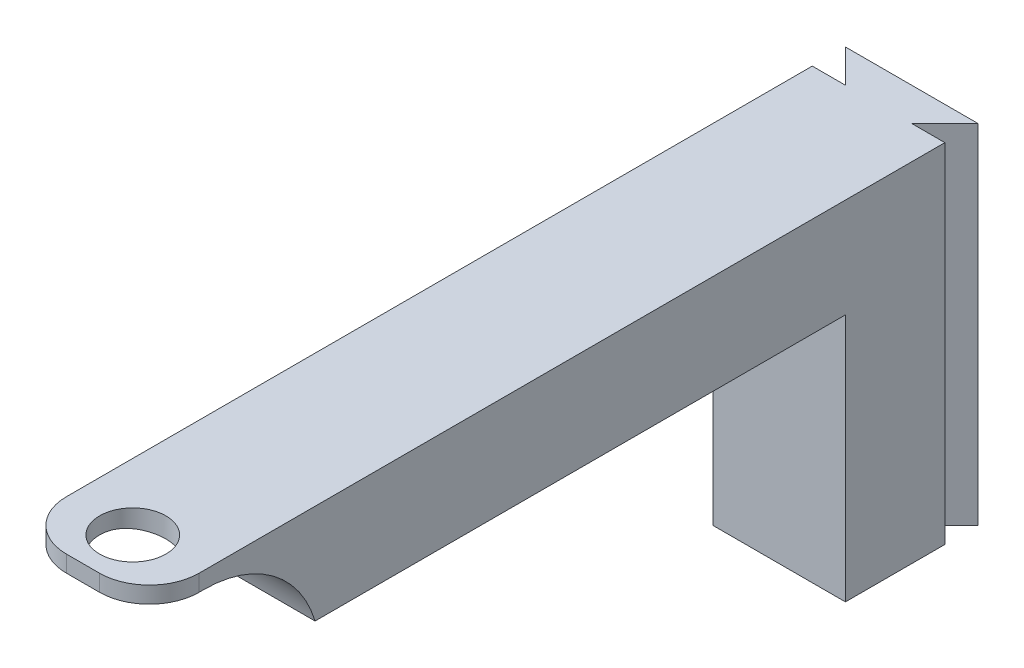
ISO-10303-21;
HEADER;
FILE_DESCRIPTION(('STEP AP214'),'2;1');
FILE_NAME('part.step','',(''),(''),'','','');
FILE_SCHEMA(('AUTOMOTIVE_DESIGN { 1 0 10303 214 1 1 1 1 }'));
ENDSEC;
DATA;
#1=APPLICATION_CONTEXT('core data for automotive mechanical design processes');
#2=APPLICATION_PROTOCOL_DEFINITION('international standard','automotive_design',2000,#1);
#3=PRODUCT_CONTEXT('',#1,'mechanical');
#4=PRODUCT('Part','Part','',(#3));
#5=PRODUCT_RELATED_PRODUCT_CATEGORY('part','',(#4));
#6=PRODUCT_DEFINITION_FORMATION('','',#4);
#7=PRODUCT_DEFINITION_CONTEXT('part definition',#1,'design');
#8=PRODUCT_DEFINITION('design','',#6,#7);
#9=PRODUCT_DEFINITION_SHAPE('','',#8);
#10=(LENGTH_UNIT() NAMED_UNIT(*) SI_UNIT(.MILLI.,.METRE.));
#11=(NAMED_UNIT(*) PLANE_ANGLE_UNIT() SI_UNIT($,.RADIAN.));
#12=(NAMED_UNIT(*) SI_UNIT($,.STERADIAN.) SOLID_ANGLE_UNIT());
#13=UNCERTAINTY_MEASURE_WITH_UNIT(LENGTH_MEASURE(1.E-05),#10,'distance_accuracy_value','');
#14=(GEOMETRIC_REPRESENTATION_CONTEXT(3) GLOBAL_UNCERTAINTY_ASSIGNED_CONTEXT((#13)) GLOBAL_UNIT_ASSIGNED_CONTEXT((#10,
#11,#12)) REPRESENTATION_CONTEXT('',''));
#15=CARTESIAN_POINT('',(0.,0.,0.));
#16=DIRECTION('',(0.,0.,1.));
#17=DIRECTION('',(1.,0.,0.));
#18=AXIS2_PLACEMENT_3D('',#15,#16,#17);
#19=CARTESIAN_POINT('',(4.,6.,25.));
#20=DIRECTION('',(-1.,0.,0.));
#21=DIRECTION('',(0.,0.,1.));
#22=AXIS2_PLACEMENT_3D('',#19,#20,#21);
#23=PLANE('',#22);
#24=DIRECTION('',(0.,-1.,0.));
#25=VECTOR('',#24,1.);
#26=CARTESIAN_POINT('',(4.,6.000012,-23.));
#27=LINE('',#26,#25);
#28=CARTESIAN_POINT('',(4.,6.,-23.));
#29=VERTEX_POINT('',#28);
#30=CARTESIAN_POINT('',(4.,-15.,-23.));
#31=VERTEX_POINT('',#30);
#32=EDGE_CURVE('E61',#29,#31,#27,.T.);
#33=ORIENTED_EDGE('',*,*,#32,.F.);
#34=DIRECTION('',(0.,0.,-1.));
#35=VECTOR('',#34,1.);
#36=CARTESIAN_POINT('',(4.,6.,25.));
#37=LINE('',#36,#35);
#38=CARTESIAN_POINT('',(4.,6.,22.));
#39=VERTEX_POINT('',#38);
#40=EDGE_CURVE('E206',#39,#29,#37,.T.);
#41=ORIENTED_EDGE('',*,*,#40,.F.);
#42=DIRECTION('',(0.,-1.,0.));
#43=VECTOR('',#42,1.);
#44=CARTESIAN_POINT('',(4.,6.,22.));
#45=LINE('',#44,#43);
#46=CARTESIAN_POINT('',(4.,5.,22.));
#47=VERTEX_POINT('',#46);
#48=EDGE_CURVE('E165',#39,#47,#45,.T.);
#49=ORIENTED_EDGE('',*,*,#48,.T.);
#50=DIRECTION('',(0.,0.,1.));
#51=VECTOR('',#50,1.);
#52=CARTESIAN_POINT('',(4.,5.,25.));
#53=LINE('',#52,#51);
#54=CARTESIAN_POINT('',(4.,5.,21.7082039324994));
#55=VERTEX_POINT('',#54);
#56=EDGE_CURVE('E195',#55,#47,#53,.T.);
#57=ORIENTED_EDGE('',*,*,#56,.F.);
#58=CARTESIAN_POINT('',(4.,-2.,21.7082039324994));
#59=DIRECTION('',(-1.,0.,0.));
#60=DIRECTION('',(0.,0.,1.));
#61=AXIS2_PLACEMENT_3D('',#58,#59,#60);
#62=CIRCLE('',#61,7.);
#63=CARTESIAN_POINT('',(4.,0.,15.));
#64=VERTEX_POINT('',#63);
#65=EDGE_CURVE('E46',#55,#64,#62,.T.);
#66=ORIENTED_EDGE('',*,*,#65,.T.);
#67=DIRECTION('',(0.,0.,-1.));
#68=VECTOR('',#67,1.);
#69=CARTESIAN_POINT('',(4.,0.,25.));
#70=LINE('',#69,#68);
#71=CARTESIAN_POINT('',(4.,0.,-17.));
#72=VERTEX_POINT('',#71);
#73=EDGE_CURVE('E203',#64,#72,#70,.T.);
#74=ORIENTED_EDGE('',*,*,#73,.T.);
#75=DIRECTION('',(0.,1.,0.));
#76=VECTOR('',#75,1.);
#77=CARTESIAN_POINT('',(4.,-15.,-17.));
#78=LINE('',#77,#76);
#79=CARTESIAN_POINT('',(4.,-15.,-17.));
#80=VERTEX_POINT('',#79);
#81=EDGE_CURVE('E174',#80,#72,#78,.T.);
#82=ORIENTED_EDGE('',*,*,#81,.F.);
#83=DIRECTION('',(0.,0.,1.));
#84=VECTOR('',#83,1.);
#85=CARTESIAN_POINT('',(4.,-15.,-25.));
#86=LINE('',#85,#84);
#87=EDGE_CURVE('E183',#31,#80,#86,.T.);
#88=ORIENTED_EDGE('',*,*,#87,.F.);
#89=EDGE_LOOP('',(#33,#41,#49,#57,#66,#74,#82,#88));
#90=FACE_BOUND('',#89,.T.);
#91=ADVANCED_FACE('F37',(#90),#23,.F.);
#92=CARTESIAN_POINT('',(-4.,6.,25.));
#93=DIRECTION('',(1.,0.,0.));
#94=DIRECTION('',(0.,0.,-1.));
#95=AXIS2_PLACEMENT_3D('',#92,#93,#94);
#96=PLANE('',#95);
#97=DIRECTION('',(0.,-1.,0.));
#98=VECTOR('',#97,1.);
#99=CARTESIAN_POINT('',(-4.,6.000012,-23.));
#100=LINE('',#99,#98);
#101=CARTESIAN_POINT('',(-4.,6.,-23.));
#102=VERTEX_POINT('',#101);
#103=CARTESIAN_POINT('',(-4.,-15.,-23.));
#104=VERTEX_POINT('',#103);
#105=EDGE_CURVE('E155',#102,#104,#100,.T.);
#106=ORIENTED_EDGE('',*,*,#105,.T.);
#107=DIRECTION('',(0.,0.,-1.));
#108=VECTOR('',#107,1.);
#109=CARTESIAN_POINT('',(-4.,-15.,-25.));
#110=LINE('',#109,#108);
#111=CARTESIAN_POINT('',(-4.,-15.,-17.));
#112=VERTEX_POINT('',#111);
#113=EDGE_CURVE('E171',#112,#104,#110,.T.);
#114=ORIENTED_EDGE('',*,*,#113,.F.);
#115=DIRECTION('',(0.,1.,0.));
#116=VECTOR('',#115,1.);
#117=CARTESIAN_POINT('',(-4.,-15.,-17.));
#118=LINE('',#117,#116);
#119=CARTESIAN_POINT('',(-4.,0.,-17.));
#120=VERTEX_POINT('',#119);
#121=EDGE_CURVE('E170',#112,#120,#118,.T.);
#122=ORIENTED_EDGE('',*,*,#121,.T.);
#123=DIRECTION('',(0.,0.,1.));
#124=VECTOR('',#123,1.);
#125=CARTESIAN_POINT('',(-4.,0.,25.));
#126=LINE('',#125,#124);
#127=CARTESIAN_POINT('',(-4.,0.,15.));
#128=VERTEX_POINT('',#127);
#129=EDGE_CURVE('E209',#120,#128,#126,.T.);
#130=ORIENTED_EDGE('',*,*,#129,.T.);
#131=CARTESIAN_POINT('',(-4.,-2.,21.7082039324994));
#132=DIRECTION('',(1.,0.,0.));
#133=DIRECTION('',(0.,0.,-1.));
#134=AXIS2_PLACEMENT_3D('',#131,#132,#133);
#135=CIRCLE('',#134,7.);
#136=CARTESIAN_POINT('',(-4.,5.,21.7082039324994));
#137=VERTEX_POINT('',#136);
#138=EDGE_CURVE('E11',#128,#137,#135,.T.);
#139=ORIENTED_EDGE('',*,*,#138,.T.);
#140=DIRECTION('',(0.,0.,-1.));
#141=VECTOR('',#140,1.);
#142=CARTESIAN_POINT('',(-4.,5.,25.));
#143=LINE('',#142,#141);
#144=CARTESIAN_POINT('',(-4.,5.,22.));
#145=VERTEX_POINT('',#144);
#146=EDGE_CURVE('E200',#145,#137,#143,.T.);
#147=ORIENTED_EDGE('',*,*,#146,.F.);
#148=DIRECTION('',(0.,-1.,0.));
#149=VECTOR('',#148,1.);
#150=CARTESIAN_POINT('',(-4.,6.,22.));
#151=LINE('',#150,#149);
#152=CARTESIAN_POINT('',(-4.,6.,22.));
#153=VERTEX_POINT('',#152);
#154=EDGE_CURVE('E235',#145,#153,#151,.F.);
#155=ORIENTED_EDGE('',*,*,#154,.T.);
#156=DIRECTION('',(0.,0.,1.));
#157=VECTOR('',#156,1.);
#158=CARTESIAN_POINT('',(-4.,6.,25.));
#159=LINE('',#158,#157);
#160=EDGE_CURVE('E211',#102,#153,#159,.T.);
#161=ORIENTED_EDGE('',*,*,#160,.F.);
#162=EDGE_LOOP('',(#106,#114,#122,#130,#139,#147,#155,#161));
#163=FACE_BOUND('',#162,.T.);
#164=ADVANCED_FACE('F266',(#163),#96,.F.);
#165=CARTESIAN_POINT('',(0.,6.,0.));
#166=DIRECTION('',(0.,-1.,0.));
#167=DIRECTION('',(0.,0.,-1.));
#168=AXIS2_PLACEMENT_3D('',#165,#166,#167);
#169=PLANE('',#168);
#170=CARTESIAN_POINT('',(0.,6.,22.));
#171=DIRECTION('',(0.,1.,0.));
#172=DIRECTION('',(0.,0.,1.));
#173=AXIS2_PLACEMENT_3D('',#170,#171,#172);
#174=CIRCLE('',#173,2.);
#175=CARTESIAN_POINT('',(0.,6.,24.));
#176=VERTEX_POINT('',#175);
#177=EDGE_CURVE('E188',#176,#176,#174,.T.);
#178=ORIENTED_EDGE('',*,*,#177,.F.);
#179=EDGE_LOOP('',(#178));
#180=FACE_BOUND('',#179,.T.);
#181=DIRECTION('',(-0.707106781186547,0.,0.707106781186548));
#182=VECTOR('',#181,1.);
#183=CARTESIAN_POINT('',(-10.5,6.,-10.5));
#184=LINE('',#183,#182);
#185=CARTESIAN_POINT('',(4.,6.,-25.));
#186=VERTEX_POINT('',#185);
#187=CARTESIAN_POINT('',(2.,6.,-23.));
#188=VERTEX_POINT('',#187);
#189=EDGE_CURVE('E184',#186,#188,#184,.T.);
#190=ORIENTED_EDGE('',*,*,#189,.F.);
#191=DIRECTION('',(-1.,0.,0.));
#192=VECTOR('',#191,1.);
#193=CARTESIAN_POINT('',(-4.,6.,-25.));
#194=LINE('',#193,#192);
#195=CARTESIAN_POINT('',(-4.,6.,-25.));
#196=VERTEX_POINT('',#195);
#197=EDGE_CURVE('E164',#186,#196,#194,.T.);
#198=ORIENTED_EDGE('',*,*,#197,.T.);
#199=DIRECTION('',(-0.707106781186547,0.,-0.707106781186548));
#200=VECTOR('',#199,1.);
#201=CARTESIAN_POINT('',(10.5,6.,-10.5));
#202=LINE('',#201,#200);
#203=CARTESIAN_POINT('',(-2.,6.,-23.));
#204=VERTEX_POINT('',#203);
#205=EDGE_CURVE('E322',#204,#196,#202,.T.);
#206=ORIENTED_EDGE('',*,*,#205,.F.);
#207=DIRECTION('',(1.,0.,0.));
#208=VECTOR('',#207,1.);
#209=CARTESIAN_POINT('',(0.,6.,-23.));
#210=LINE('',#209,#208);
#211=EDGE_CURVE('E310',#102,#204,#210,.T.);
#212=ORIENTED_EDGE('',*,*,#211,.F.);
#213=ORIENTED_EDGE('',*,*,#160,.T.);
#214=CARTESIAN_POINT('',(-1.,6.,22.));
#215=DIRECTION('',(0.,-1.,0.));
#216=DIRECTION('',(0.,0.,-1.));
#217=AXIS2_PLACEMENT_3D('',#214,#215,#216);
#218=CIRCLE('',#217,3.);
#219=CARTESIAN_POINT('',(-1.,6.,25.));
#220=VERTEX_POINT('',#219);
#221=EDGE_CURVE('E231',#153,#220,#218,.F.);
#222=ORIENTED_EDGE('',*,*,#221,.T.);
#223=DIRECTION('',(1.,0.,0.));
#224=VECTOR('',#223,1.);
#225=CARTESIAN_POINT('',(-4.,6.,25.));
#226=LINE('',#225,#224);
#227=CARTESIAN_POINT('',(0.999999999999999,6.,25.));
#228=VERTEX_POINT('',#227);
#229=EDGE_CURVE('E213',#220,#228,#226,.T.);
#230=ORIENTED_EDGE('',*,*,#229,.T.);
#231=CARTESIAN_POINT('',(0.999999999999999,6.,22.));
#232=DIRECTION('',(0.,-1.,0.));
#233=DIRECTION('',(0.,0.,-1.));
#234=AXIS2_PLACEMENT_3D('',#231,#232,#233);
#235=CIRCLE('',#234,3.);
#236=EDGE_CURVE('E233',#228,#39,#235,.F.);
#237=ORIENTED_EDGE('',*,*,#236,.T.);
#238=ORIENTED_EDGE('',*,*,#40,.T.);
#239=DIRECTION('',(1.,0.,0.));
#240=VECTOR('',#239,1.);
#241=CARTESIAN_POINT('',(0.,6.,-23.));
#242=LINE('',#241,#240);
#243=EDGE_CURVE('E324',#188,#29,#242,.T.);
#244=ORIENTED_EDGE('',*,*,#243,.F.);
#245=EDGE_LOOP('',(#190,#198,#206,#212,#213,#222,#230,#237,#238,#244));
#246=FACE_BOUND('',#245,.T.);
#247=ADVANCED_FACE('F263',(#180,#246),#169,.F.);
#248=CARTESIAN_POINT('',(0.,-15.,0.));
#249=DIRECTION('',(0.,-1.,0.));
#250=DIRECTION('',(0.,0.,-1.));
#251=AXIS2_PLACEMENT_3D('',#248,#249,#250);
#252=PLANE('',#251);
#253=DIRECTION('',(1.,0.,0.));
#254=VECTOR('',#253,1.);
#255=CARTESIAN_POINT('',(4.,-15.,-25.));
#256=LINE('',#255,#254);
#257=CARTESIAN_POINT('',(-4.,-15.,-25.));
#258=VERTEX_POINT('',#257);
#259=CARTESIAN_POINT('',(4.,-15.,-25.));
#260=VERTEX_POINT('',#259);
#261=EDGE_CURVE('E162',#258,#260,#256,.T.);
#262=ORIENTED_EDGE('',*,*,#261,.T.);
#263=DIRECTION('',(-0.707106781186547,0.,0.707106781186548));
#264=VECTOR('',#263,1.);
#265=CARTESIAN_POINT('',(2.,-15.,-23.));
#266=LINE('',#265,#264);
#267=CARTESIAN_POINT('',(2.,-15.,-23.));
#268=VERTEX_POINT('',#267);
#269=EDGE_CURVE('E145',#260,#268,#266,.T.);
#270=ORIENTED_EDGE('',*,*,#269,.T.);
#271=DIRECTION('',(1.,0.,0.));
#272=VECTOR('',#271,1.);
#273=CARTESIAN_POINT('',(4.,-15.,-23.));
#274=LINE('',#273,#272);
#275=EDGE_CURVE('E154',#268,#31,#274,.T.);
#276=ORIENTED_EDGE('',*,*,#275,.T.);
#277=ORIENTED_EDGE('',*,*,#87,.T.);
#278=DIRECTION('',(-1.,0.,0.));
#279=VECTOR('',#278,1.);
#280=CARTESIAN_POINT('',(4.,-15.,-17.));
#281=LINE('',#280,#279);
#282=EDGE_CURVE('E177',#80,#112,#281,.T.);
#283=ORIENTED_EDGE('',*,*,#282,.T.);
#284=ORIENTED_EDGE('',*,*,#113,.T.);
#285=DIRECTION('',(1.,0.,0.));
#286=VECTOR('',#285,1.);
#287=CARTESIAN_POINT('',(-4.,-15.,-23.));
#288=LINE('',#287,#286);
#289=CARTESIAN_POINT('',(-2.,-15.,-23.));
#290=VERTEX_POINT('',#289);
#291=EDGE_CURVE('E314',#104,#290,#288,.T.);
#292=ORIENTED_EDGE('',*,*,#291,.T.);
#293=DIRECTION('',(-0.707106781186547,0.,-0.707106781186548));
#294=VECTOR('',#293,1.);
#295=CARTESIAN_POINT('',(-2.,-15.,-23.));
#296=LINE('',#295,#294);
#297=EDGE_CURVE('E53',#290,#258,#296,.T.);
#298=ORIENTED_EDGE('',*,*,#297,.T.);
#299=EDGE_LOOP('',(#262,#270,#276,#277,#283,#284,#292,#298));
#300=FACE_BOUND('',#299,.T.);
#301=ADVANCED_FACE('F168',(#300),#252,.T.);
#302=CARTESIAN_POINT('',(-4.,6.,-25.));
#303=DIRECTION('',(0.,0.,1.));
#304=DIRECTION('',(1.,0.,0.));
#305=AXIS2_PLACEMENT_3D('',#302,#303,#304);
#306=PLANE('',#305);
#307=DIRECTION('',(0.,-1.,0.));
#308=VECTOR('',#307,1.);
#309=CARTESIAN_POINT('',(4.,6.,-25.));
#310=LINE('',#309,#308);
#311=EDGE_CURVE('E148',#186,#260,#310,.T.);
#312=ORIENTED_EDGE('',*,*,#311,.T.);
#313=ORIENTED_EDGE('',*,*,#261,.F.);
#314=DIRECTION('',(0.,-1.,0.));
#315=VECTOR('',#314,1.);
#316=CARTESIAN_POINT('',(-4.,6.,-25.));
#317=LINE('',#316,#315);
#318=EDGE_CURVE('E166',#196,#258,#317,.T.);
#319=ORIENTED_EDGE('',*,*,#318,.F.);
#320=ORIENTED_EDGE('',*,*,#197,.F.);
#321=EDGE_LOOP('',(#312,#313,#319,#320));
#322=FACE_BOUND('',#321,.T.);
#323=ADVANCED_FACE('F160',(#322),#306,.F.);
#324=CARTESIAN_POINT('',(-4.,6.,25.));
#325=DIRECTION('',(0.,0.,-1.));
#326=DIRECTION('',(-1.,0.,0.));
#327=AXIS2_PLACEMENT_3D('',#324,#325,#326);
#328=PLANE('',#327);
#329=DIRECTION('',(-1.,0.,0.));
#330=VECTOR('',#329,1.);
#331=CARTESIAN_POINT('',(4.,5.,25.));
#332=LINE('',#331,#330);
#333=CARTESIAN_POINT('',(0.999999999999999,5.,25.));
#334=VERTEX_POINT('',#333);
#335=CARTESIAN_POINT('',(-1.,5.,25.));
#336=VERTEX_POINT('',#335);
#337=EDGE_CURVE('E197',#334,#336,#332,.T.);
#338=ORIENTED_EDGE('',*,*,#337,.F.);
#339=DIRECTION('',(0.,-1.,0.));
#340=VECTOR('',#339,1.);
#341=CARTESIAN_POINT('',(0.999999999999999,6.,25.));
#342=LINE('',#341,#340);
#343=EDGE_CURVE('E229',#334,#228,#342,.F.);
#344=ORIENTED_EDGE('',*,*,#343,.T.);
#345=ORIENTED_EDGE('',*,*,#229,.F.);
#346=DIRECTION('',(0.,-1.,0.));
#347=VECTOR('',#346,1.);
#348=CARTESIAN_POINT('',(-1.,6.,25.));
#349=LINE('',#348,#347);
#350=EDGE_CURVE('E226',#220,#336,#349,.T.);
#351=ORIENTED_EDGE('',*,*,#350,.T.);
#352=EDGE_LOOP('',(#338,#344,#345,#351));
#353=FACE_BOUND('',#352,.T.);
#354=ADVANCED_FACE('F270',(#353),#328,.F.);
#355=CARTESIAN_POINT('',(0.,0.,0.));
#356=DIRECTION('',(0.,-1.,0.));
#357=DIRECTION('',(0.,0.,-1.));
#358=AXIS2_PLACEMENT_3D('',#355,#356,#357);
#359=PLANE('',#358);
#360=DIRECTION('',(-1.,0.,0.));
#361=VECTOR('',#360,1.);
#362=CARTESIAN_POINT('',(4.,0.,-17.));
#363=LINE('',#362,#361);
#364=EDGE_CURVE('E181',#72,#120,#363,.T.);
#365=ORIENTED_EDGE('',*,*,#364,.F.);
#366=ORIENTED_EDGE('',*,*,#73,.F.);
#367=DIRECTION('',(1.,0.,0.));
#368=VECTOR('',#367,1.);
#369=CARTESIAN_POINT('',(4.,0.,15.));
#370=LINE('',#369,#368);
#371=EDGE_CURVE('E194',#128,#64,#370,.T.);
#372=ORIENTED_EDGE('',*,*,#371,.F.);
#373=ORIENTED_EDGE('',*,*,#129,.F.);
#374=EDGE_LOOP('',(#365,#366,#372,#373));
#375=FACE_BOUND('',#374,.T.);
#376=ADVANCED_FACE('F261',(#375),#359,.T.);
#377=CARTESIAN_POINT('',(0.,5.,0.));
#378=DIRECTION('',(0.,1.,0.));
#379=DIRECTION('',(0.,0.,1.));
#380=AXIS2_PLACEMENT_3D('',#377,#378,#379);
#381=PLANE('',#380);
#382=ORIENTED_EDGE('',*,*,#146,.T.);
#383=DIRECTION('',(-1.,0.,0.));
#384=VECTOR('',#383,1.);
#385=CARTESIAN_POINT('',(0.,5.,21.7082039324994));
#386=LINE('',#385,#384);
#387=CARTESIAN_POINT('',(-1.97859926589271,5.,21.7082039324994));
#388=VERTEX_POINT('',#387);
#389=EDGE_CURVE('E240',#137,#388,#386,.F.);
#390=ORIENTED_EDGE('',*,*,#389,.T.);
#391=CARTESIAN_POINT('',(0.,5.,22.));
#392=DIRECTION('',(0.,1.,0.));
#393=DIRECTION('',(0.,0.,1.));
#394=AXIS2_PLACEMENT_3D('',#391,#392,#393);
#395=CIRCLE('',#394,2.);
#396=CARTESIAN_POINT('',(1.97859926589271,5.,21.7082039324994));
#397=VERTEX_POINT('',#396);
#398=EDGE_CURVE('E191',#397,#388,#395,.F.);
#399=ORIENTED_EDGE('',*,*,#398,.F.);
#400=DIRECTION('',(-1.,0.,0.));
#401=VECTOR('',#400,1.);
#402=CARTESIAN_POINT('',(0.,5.,21.7082039324994));
#403=LINE('',#402,#401);
#404=EDGE_CURVE('E238',#397,#55,#403,.F.);
#405=ORIENTED_EDGE('',*,*,#404,.T.);
#406=ORIENTED_EDGE('',*,*,#56,.T.);
#407=CARTESIAN_POINT('',(0.999999999999999,5.,22.));
#408=DIRECTION('',(0.,1.,0.));
#409=DIRECTION('',(0.,0.,1.));
#410=AXIS2_PLACEMENT_3D('',#407,#408,#409);
#411=CIRCLE('',#410,3.);
#412=EDGE_CURVE('E224',#47,#334,#411,.F.);
#413=ORIENTED_EDGE('',*,*,#412,.T.);
#414=ORIENTED_EDGE('',*,*,#337,.T.);
#415=CARTESIAN_POINT('',(-1.,5.,22.));
#416=DIRECTION('',(0.,1.,0.));
#417=DIRECTION('',(0.,0.,1.));
#418=AXIS2_PLACEMENT_3D('',#415,#416,#417);
#419=CIRCLE('',#418,3.);
#420=EDGE_CURVE('E222',#336,#145,#419,.F.);
#421=ORIENTED_EDGE('',*,*,#420,.T.);
#422=EDGE_LOOP('',(#382,#390,#399,#405,#406,#413,#414,#421));
#423=FACE_BOUND('',#422,.T.);
#424=ADVANCED_FACE('F255',(#423),#381,.F.);
#425=CARTESIAN_POINT('',(0.,-0.00100000000000013,22.));
#426=DIRECTION('',(0.,1.,0.));
#427=DIRECTION('',(0.,0.,1.));
#428=AXIS2_PLACEMENT_3D('',#425,#426,#427);
#429=CYLINDRICAL_SURFACE('',#428,2.);
#430=ORIENTED_EDGE('',*,*,#177,.T.);
#431=EDGE_LOOP('',(#430));
#432=FACE_BOUND('',#431,.T.);
#433=ORIENTED_EDGE('',*,*,#398,.T.);
#434=CARTESIAN_POINT('',(-1.97859926589271,5.,21.7082039324994));
#435=CARTESIAN_POINT('',(-1.97051932659087,5.00000343713979,21.6534103102538));
#436=CARTESIAN_POINT('',(-1.96016445126654,4.99935595729873,21.5989809996655));
#437=CARTESIAN_POINT('',(-1.93499130449663,4.99684278572863,21.49120493273));
#438=CARTESIAN_POINT('',(-1.92017397307267,4.99497735046677,21.4378579509127));
#439=CARTESIAN_POINT('',(-1.86925021813745,4.98769319323829,21.2802425839352));
#440=CARTESIAN_POINT('',(-1.8266240393413,4.9805856509025,21.1780774920177));
#441=CARTESIAN_POINT('',(-1.72533764417593,4.96297295315906,20.9824747134704));
#442=CARTESIAN_POINT('',(-1.66668159414998,4.9524686804699,20.8890347675325));
#443=CARTESIAN_POINT('',(-1.53496264942972,4.92948462805851,20.7131591235795));
#444=CARTESIAN_POINT('',(-1.46189512806379,4.91700421416857,20.6307269738072));
#445=CARTESIAN_POINT('',(-1.30156361481696,4.89138258087143,20.4773357089019));
#446=CARTESIAN_POINT('',(-1.21402731013548,4.8782329135835,20.406662543328));
#447=CARTESIAN_POINT('',(-1.02821948254142,4.85323937446888,20.2808868048644));
#448=CARTESIAN_POINT('',(-0.929947118790284,4.84139560506511,20.2257854527592));
#449=CARTESIAN_POINT('',(-0.724656504967226,4.82051193259974,20.1324722060938));
#450=CARTESIAN_POINT('',(-0.617588458544432,4.81148961413984,20.0943656276487));
#451=CARTESIAN_POINT('',(-0.39830449256697,4.79759241618392,20.0367893877439));
#452=CARTESIAN_POINT('',(-0.286089849615028,4.79271651397925,20.0173151304958));
#453=CARTESIAN_POINT('',(-0.0628453308607723,4.78786181810614,19.997932308777));
#454=CARTESIAN_POINT('',(0.0481386847254595,4.78775819334056,19.9975249950172));
#455=CARTESIAN_POINT('',(0.268553705349641,4.79214591927274,20.0150314718204));
#456=CARTESIAN_POINT('',(0.377984774230042,4.79663708051838,20.0329445069992));
#457=CARTESIAN_POINT('',(0.590919969243098,4.80953419840264,20.0861760662486));
#458=CARTESIAN_POINT('',(0.694477918393921,4.81789438114136,20.1212913496116));
#459=CARTESIAN_POINT('',(0.894285662048944,4.837443700008,20.2077645910928));
#460=CARTESIAN_POINT('',(0.990534455396502,4.84863322277342,20.2591247693636));
#461=CARTESIAN_POINT('',(1.1754321377698,4.87273199726156,20.3780497571907));
#462=CARTESIAN_POINT('',(1.26385154889354,4.88567525862353,20.445964420414));
#463=CARTESIAN_POINT('',(1.42823943841375,4.91142131066639,20.5955484465296));
#464=CARTESIAN_POINT('',(1.5042043789277,4.92422406047248,20.6772217044483));
#465=CARTESIAN_POINT('',(1.64289585425982,4.94824470629798,20.8538181020398));
#466=CARTESIAN_POINT('',(1.70535357166439,4.95942916907359,20.9489570763649));
#467=CARTESIAN_POINT('',(1.81330736430922,4.97831869666593,21.1486693305839));
#468=CARTESIAN_POINT('',(1.85882331204387,4.98602784024717,21.253231377278));
#469=CARTESIAN_POINT('',(1.91419633667263,4.99418712162887,21.4174018870769));
#470=CARTESIAN_POINT('',(1.93071995661781,4.99634589512232,21.4747579839976));
#471=CARTESIAN_POINT('',(1.95857011123507,4.99925390916452,21.5906711104765));
#472=CARTESIAN_POINT('',(1.96990360790725,5.00000504212346,21.6492264205451));
#473=CARTESIAN_POINT('',(1.97859926589271,5.,21.7082039324994));
#474=B_SPLINE_CURVE_WITH_KNOTS('',3,(#434,#435,#436,#437,#438,#439,#440,#441,#442,#443,#444,
#445,#446,#447,#448,#449,#450,#451,#452,#453,#454,#455,#456,#457,#458,#459,#460,#461,#462,#463,
#464,#465,#466,#467,#468,#469,#470,#471,#472,#473),.UNSPECIFIED.,.F.,.F.,(4,2,2,2,2,2,2,2,2,2,2,
2,2,2,2,2,2,2,2,4),(0.,0.166051375892931,0.332067797305899,0.663135941915832,0.994118119905661,
1.32520673017662,1.66343964047296,2.00169905988474,2.34202648622499,2.6822699468417,
3.01360827437928,3.34493294073255,3.67243419745032,3.99998023237168,4.33516209061209,
4.67043899802243,5.01187479596644,5.3529088221342,5.53186702270184,5.71058446155446),.UNSPECIFIED.);
#475=EDGE_CURVE('E243',#388,#397,#474,.T.);
#476=ORIENTED_EDGE('',*,*,#475,.T.);
#477=EDGE_LOOP('',(#433,#476));
#478=FACE_BOUND('',#477,.T.);
#479=ADVANCED_FACE('F249',(#432,#478),#429,.F.);
#480=CARTESIAN_POINT('',(0.999999999999999,6.,22.));
#481=DIRECTION('',(0.,-1.,0.));
#482=DIRECTION('',(0.,0.,-1.));
#483=AXIS2_PLACEMENT_3D('',#480,#481,#482);
#484=CYLINDRICAL_SURFACE('',#483,3.);
#485=ORIENTED_EDGE('',*,*,#236,.F.);
#486=ORIENTED_EDGE('',*,*,#343,.F.);
#487=ORIENTED_EDGE('',*,*,#412,.F.);
#488=ORIENTED_EDGE('',*,*,#48,.F.);
#489=EDGE_LOOP('',(#485,#486,#487,#488));
#490=FACE_BOUND('',#489,.T.);
#491=ADVANCED_FACE('F254',(#490),#484,.T.);
#492=CARTESIAN_POINT('',(-1.,6.,22.));
#493=DIRECTION('',(0.,-1.,0.));
#494=DIRECTION('',(0.,0.,-1.));
#495=AXIS2_PLACEMENT_3D('',#492,#493,#494);
#496=CYLINDRICAL_SURFACE('',#495,3.);
#497=ORIENTED_EDGE('',*,*,#221,.F.);
#498=ORIENTED_EDGE('',*,*,#154,.F.);
#499=ORIENTED_EDGE('',*,*,#420,.F.);
#500=ORIENTED_EDGE('',*,*,#350,.F.);
#501=EDGE_LOOP('',(#497,#498,#499,#500));
#502=FACE_BOUND('',#501,.T.);
#503=ADVANCED_FACE('F284',(#502),#496,.T.);
#504=CARTESIAN_POINT('',(4.,-2.,21.7082039324994));
#505=DIRECTION('',(-1.,0.,0.));
#506=DIRECTION('',(0.,0.,1.));
#507=AXIS2_PLACEMENT_3D('',#504,#505,#506);
#508=CYLINDRICAL_SURFACE('',#507,7.);
#509=ORIENTED_EDGE('',*,*,#138,.F.);
#510=ORIENTED_EDGE('',*,*,#371,.T.);
#511=ORIENTED_EDGE('',*,*,#65,.F.);
#512=ORIENTED_EDGE('',*,*,#404,.F.);
#513=ORIENTED_EDGE('',*,*,#475,.F.);
#514=ORIENTED_EDGE('',*,*,#389,.F.);
#515=EDGE_LOOP('',(#509,#510,#511,#512,#513,#514));
#516=FACE_BOUND('',#515,.T.);
#517=ADVANCED_FACE('F39',(#516),#508,.F.);
#518=CARTESIAN_POINT('',(4.,-15.,-17.));
#519=DIRECTION('',(0.,0.,-1.));
#520=DIRECTION('',(-1.,0.,0.));
#521=AXIS2_PLACEMENT_3D('',#518,#519,#520);
#522=PLANE('',#521);
#523=ORIENTED_EDGE('',*,*,#364,.T.);
#524=ORIENTED_EDGE('',*,*,#121,.F.);
#525=ORIENTED_EDGE('',*,*,#282,.F.);
#526=ORIENTED_EDGE('',*,*,#81,.T.);
#527=EDGE_LOOP('',(#523,#524,#525,#526));
#528=FACE_BOUND('',#527,.T.);
#529=ADVANCED_FACE('F257',(#528),#522,.F.);
#530=CARTESIAN_POINT('',(-2.,6.000012,-23.));
#531=DIRECTION('',(-0.707106781186548,0.,0.707106781186547));
#532=DIRECTION('',(0.707106781186547,0.,0.707106781186548));
#533=AXIS2_PLACEMENT_3D('',#530,#531,#532);
#534=PLANE('',#533);
#535=ORIENTED_EDGE('',*,*,#205,.T.);
#536=ORIENTED_EDGE('',*,*,#318,.T.);
#537=ORIENTED_EDGE('',*,*,#297,.F.);
#538=DIRECTION('',(0.,-1.,0.));
#539=VECTOR('',#538,1.);
#540=CARTESIAN_POINT('',(-2.,6.000012,-23.));
#541=LINE('',#540,#539);
#542=EDGE_CURVE('E317',#204,#290,#541,.T.);
#543=ORIENTED_EDGE('',*,*,#542,.F.);
#544=EDGE_LOOP('',(#535,#536,#537,#543));
#545=FACE_BOUND('',#544,.T.);
#546=ADVANCED_FACE('F334',(#545),#534,.T.);
#547=CARTESIAN_POINT('',(-4.,6.000012,-23.));
#548=DIRECTION('',(0.,0.,-1.));
#549=DIRECTION('',(-1.,0.,0.));
#550=AXIS2_PLACEMENT_3D('',#547,#548,#549);
#551=PLANE('',#550);
#552=ORIENTED_EDGE('',*,*,#211,.T.);
#553=ORIENTED_EDGE('',*,*,#542,.T.);
#554=ORIENTED_EDGE('',*,*,#291,.F.);
#555=ORIENTED_EDGE('',*,*,#105,.F.);
#556=EDGE_LOOP('',(#552,#553,#554,#555));
#557=FACE_BOUND('',#556,.T.);
#558=ADVANCED_FACE('F332',(#557),#551,.T.);
#559=CARTESIAN_POINT('',(2.,6.000012,-23.));
#560=DIRECTION('',(0.707106781186548,0.,0.707106781186547));
#561=DIRECTION('',(0.707106781186547,0.,-0.707106781186548));
#562=AXIS2_PLACEMENT_3D('',#559,#560,#561);
#563=PLANE('',#562);
#564=ORIENTED_EDGE('',*,*,#189,.T.);
#565=DIRECTION('',(0.,-1.,0.));
#566=VECTOR('',#565,1.);
#567=CARTESIAN_POINT('',(2.,6.000012,-23.));
#568=LINE('',#567,#566);
#569=EDGE_CURVE('E151',#188,#268,#568,.T.);
#570=ORIENTED_EDGE('',*,*,#569,.T.);
#571=ORIENTED_EDGE('',*,*,#269,.F.);
#572=ORIENTED_EDGE('',*,*,#311,.F.);
#573=EDGE_LOOP('',(#564,#570,#571,#572));
#574=FACE_BOUND('',#573,.T.);
#575=ADVANCED_FACE('F147',(#574),#563,.T.);
#576=CARTESIAN_POINT('',(4.,6.000012,-23.));
#577=DIRECTION('',(0.,0.,-1.));
#578=DIRECTION('',(-1.,0.,0.));
#579=AXIS2_PLACEMENT_3D('',#576,#577,#578);
#580=PLANE('',#579);
#581=ORIENTED_EDGE('',*,*,#243,.T.);
#582=ORIENTED_EDGE('',*,*,#32,.T.);
#583=ORIENTED_EDGE('',*,*,#275,.F.);
#584=ORIENTED_EDGE('',*,*,#569,.F.);
#585=EDGE_LOOP('',(#581,#582,#583,#584));
#586=FACE_BOUND('',#585,.T.);
#587=ADVANCED_FACE('F432',(#586),#580,.T.);
#588=CLOSED_SHELL('',(#91,#164,#247,#301,#323,#354,#376,#424,#479,#491,#503,#517,#529,#546,#558,
#575,#587));
#589=MANIFOLD_SOLID_BREP('B2',#588);
#590=ADVANCED_BREP_SHAPE_REPRESENTATION('',(#18,#589),#14);
#591=SHAPE_DEFINITION_REPRESENTATION(#9,#590);
ENDSEC;
END-ISO-10303-21;
